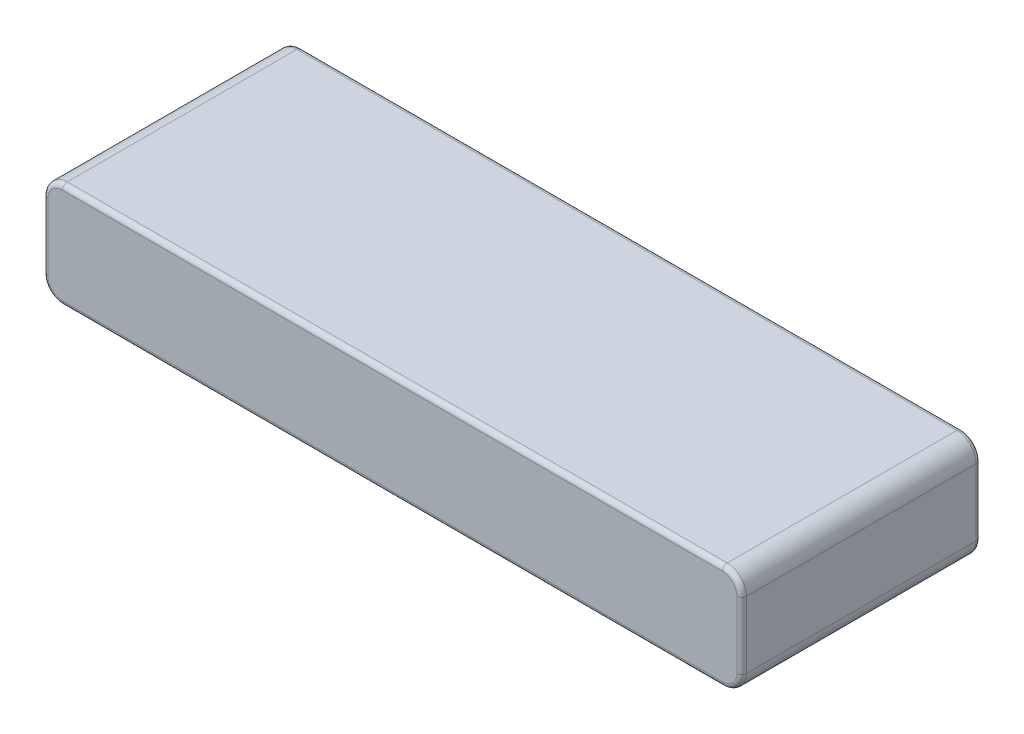
ISO-10303-21;
HEADER;
FILE_DESCRIPTION(('STEP AP214'),'2;1');
FILE_NAME('part.step','',(''),(''),'','','');
FILE_SCHEMA(('AUTOMOTIVE_DESIGN { 1 0 10303 214 1 1 1 1 }'));
ENDSEC;
DATA;
#1=APPLICATION_CONTEXT('core data for automotive mechanical design processes');
#2=APPLICATION_PROTOCOL_DEFINITION('international standard','automotive_design',2000,#1);
#3=PRODUCT_CONTEXT('',#1,'mechanical');
#4=PRODUCT('Part','Part','',(#3));
#5=PRODUCT_RELATED_PRODUCT_CATEGORY('part','',(#4));
#6=PRODUCT_DEFINITION_FORMATION('','',#4);
#7=PRODUCT_DEFINITION_CONTEXT('part definition',#1,'design');
#8=PRODUCT_DEFINITION('design','',#6,#7);
#9=PRODUCT_DEFINITION_SHAPE('','',#8);
#10=(LENGTH_UNIT() NAMED_UNIT(*) SI_UNIT(.MILLI.,.METRE.));
#11=(NAMED_UNIT(*) PLANE_ANGLE_UNIT() SI_UNIT($,.RADIAN.));
#12=(NAMED_UNIT(*) SI_UNIT($,.STERADIAN.) SOLID_ANGLE_UNIT());
#13=UNCERTAINTY_MEASURE_WITH_UNIT(LENGTH_MEASURE(1.E-05),#10,'distance_accuracy_value','');
#14=(GEOMETRIC_REPRESENTATION_CONTEXT(3) GLOBAL_UNCERTAINTY_ASSIGNED_CONTEXT((#13)) GLOBAL_UNIT_ASSIGNED_CONTEXT((#10,
#11,#12)) REPRESENTATION_CONTEXT('',''));
#15=CARTESIAN_POINT('',(0.,0.,0.));
#16=DIRECTION('',(0.,0.,1.));
#17=DIRECTION('',(1.,0.,0.));
#18=AXIS2_PLACEMENT_3D('',#15,#16,#17);
#19=CARTESIAN_POINT('',(72.4789,21.8694,-24.8158));
#20=DIRECTION('',(-1.,0.,0.));
#21=DIRECTION('',(0.,0.,1.));
#22=AXIS2_PLACEMENT_3D('',#19,#20,#21);
#23=PLANE('',#22);
#24=DIRECTION('',(0.,0.,-1.));
#25=VECTOR('',#24,1.);
#26=CARTESIAN_POINT('',(72.4789,17.8694,24.8158));
#27=LINE('',#26,#25);
#28=CARTESIAN_POINT('',(72.4789,17.8694,-23.8158));
#29=VERTEX_POINT('',#28);
#30=CARTESIAN_POINT('',(72.4789,17.8694,23.8158));
#31=VERTEX_POINT('',#30);
#32=EDGE_CURVE('E251',#29,#31,#27,.F.);
#33=ORIENTED_EDGE('',*,*,#32,.T.);
#34=DIRECTION('',(0.,-1.,0.));
#35=VECTOR('',#34,1.);
#36=CARTESIAN_POINT('',(72.4789,21.8694,23.8158));
#37=LINE('',#36,#35);
#38=CARTESIAN_POINT('',(72.4789,4.,23.8158));
#39=VERTEX_POINT('',#38);
#40=EDGE_CURVE('E214',#31,#39,#37,.T.);
#41=ORIENTED_EDGE('',*,*,#40,.T.);
#42=DIRECTION('',(0.,0.,-1.));
#43=VECTOR('',#42,1.);
#44=CARTESIAN_POINT('',(72.4789,4.,-24.8158));
#45=LINE('',#44,#43);
#46=CARTESIAN_POINT('',(72.4789,4.,-23.8158));
#47=VERTEX_POINT('',#46);
#48=EDGE_CURVE('E295',#39,#47,#45,.T.);
#49=ORIENTED_EDGE('',*,*,#48,.T.);
#50=DIRECTION('',(0.,-1.,0.));
#51=VECTOR('',#50,1.);
#52=CARTESIAN_POINT('',(72.4789,21.8694,-23.8158));
#53=LINE('',#52,#51);
#54=EDGE_CURVE('E212',#47,#29,#53,.F.);
#55=ORIENTED_EDGE('',*,*,#54,.T.);
#56=EDGE_LOOP('',(#33,#41,#49,#55));
#57=FACE_BOUND('',#56,.T.);
#58=ADVANCED_FACE('F32',(#57),#23,.F.);
#59=CARTESIAN_POINT('',(-72.4789,21.8694,-24.8158));
#60=DIRECTION('',(0.,0.,1.));
#61=DIRECTION('',(1.,0.,0.));
#62=AXIS2_PLACEMENT_3D('',#59,#60,#61);
#63=PLANE('',#62);
#64=DIRECTION('',(-1.,0.,0.));
#65=VECTOR('',#64,1.);
#66=CARTESIAN_POINT('',(68.4789,20.8694,-24.8158));
#67=LINE('',#66,#65);
#68=CARTESIAN_POINT('',(-68.4789,20.8694,-24.8158));
#69=VERTEX_POINT('',#68);
#70=CARTESIAN_POINT('',(68.4789,20.8694,-24.8158));
#71=VERTEX_POINT('',#70);
#72=EDGE_CURVE('E220',#69,#71,#67,.F.);
#73=ORIENTED_EDGE('',*,*,#72,.T.);
#74=CARTESIAN_POINT('',(68.4789,17.8694,-24.8158));
#75=DIRECTION('',(0.,0.,1.));
#76=DIRECTION('',(1.,0.,0.));
#77=AXIS2_PLACEMENT_3D('',#74,#75,#76);
#78=CIRCLE('',#77,3.);
#79=CARTESIAN_POINT('',(71.4789,17.8694,-24.8158));
#80=VERTEX_POINT('',#79);
#81=EDGE_CURVE('E233',#71,#80,#78,.F.);
#82=ORIENTED_EDGE('',*,*,#81,.T.);
#83=DIRECTION('',(0.,-1.,0.));
#84=VECTOR('',#83,1.);
#85=CARTESIAN_POINT('',(71.4789,21.8694,-24.8158));
#86=LINE('',#85,#84);
#87=CARTESIAN_POINT('',(71.4789,4.,-24.8158));
#88=VERTEX_POINT('',#87);
#89=EDGE_CURVE('E56',#80,#88,#86,.T.);
#90=ORIENTED_EDGE('',*,*,#89,.T.);
#91=CARTESIAN_POINT('',(68.4789,4.,-24.8158));
#92=DIRECTION('',(0.,0.,1.));
#93=DIRECTION('',(1.,0.,0.));
#94=AXIS2_PLACEMENT_3D('',#91,#92,#93);
#95=CIRCLE('',#94,3.);
#96=CARTESIAN_POINT('',(68.4789,1.,-24.8158));
#97=VERTEX_POINT('',#96);
#98=EDGE_CURVE('E230',#88,#97,#95,.F.);
#99=ORIENTED_EDGE('',*,*,#98,.T.);
#100=DIRECTION('',(-1.,0.,0.));
#101=VECTOR('',#100,1.);
#102=CARTESIAN_POINT('',(-72.4789,1.,-24.8158));
#103=LINE('',#102,#101);
#104=CARTESIAN_POINT('',(-68.4789,1.,-24.8158));
#105=VERTEX_POINT('',#104);
#106=EDGE_CURVE('E228',#97,#105,#103,.T.);
#107=ORIENTED_EDGE('',*,*,#106,.T.);
#108=CARTESIAN_POINT('',(-68.4789,4.,-24.8158));
#109=DIRECTION('',(0.,0.,1.));
#110=DIRECTION('',(1.,0.,0.));
#111=AXIS2_PLACEMENT_3D('',#108,#109,#110);
#112=CIRCLE('',#111,3.);
#113=CARTESIAN_POINT('',(-71.4789,4.,-24.8158));
#114=VERTEX_POINT('',#113);
#115=EDGE_CURVE('E226',#105,#114,#112,.F.);
#116=ORIENTED_EDGE('',*,*,#115,.T.);
#117=DIRECTION('',(0.,-1.,0.));
#118=VECTOR('',#117,1.);
#119=CARTESIAN_POINT('',(-71.4789,21.8694,-24.8158));
#120=LINE('',#119,#118);
#121=CARTESIAN_POINT('',(-71.4789,17.8694,-24.8158));
#122=VERTEX_POINT('',#121);
#123=EDGE_CURVE('E224',#114,#122,#120,.F.);
#124=ORIENTED_EDGE('',*,*,#123,.T.);
#125=CARTESIAN_POINT('',(-68.4789,17.8694,-24.8158));
#126=DIRECTION('',(0.,0.,1.));
#127=DIRECTION('',(1.,0.,0.));
#128=AXIS2_PLACEMENT_3D('',#125,#126,#127);
#129=CIRCLE('',#128,3.);
#130=EDGE_CURVE('E222',#122,#69,#129,.F.);
#131=ORIENTED_EDGE('',*,*,#130,.T.);
#132=EDGE_LOOP('',(#73,#82,#90,#99,#107,#116,#124,#131));
#133=FACE_BOUND('',#132,.T.);
#134=ADVANCED_FACE('F369',(#133),#63,.F.);
#135=CARTESIAN_POINT('',(-72.4789,21.8694,-24.8158));
#136=DIRECTION('',(1.,0.,0.));
#137=DIRECTION('',(0.,0.,-1.));
#138=AXIS2_PLACEMENT_3D('',#135,#136,#137);
#139=PLANE('',#138);
#140=DIRECTION('',(0.,0.,1.));
#141=VECTOR('',#140,1.);
#142=CARTESIAN_POINT('',(-72.4789,4.,-24.8158));
#143=LINE('',#142,#141);
#144=CARTESIAN_POINT('',(-72.4789,4.,-23.8158));
#145=VERTEX_POINT('',#144);
#146=CARTESIAN_POINT('',(-72.4789,4.,23.8158));
#147=VERTEX_POINT('',#146);
#148=EDGE_CURVE('E173',#145,#147,#143,.T.);
#149=ORIENTED_EDGE('',*,*,#148,.T.);
#150=DIRECTION('',(0.,-1.,0.));
#151=VECTOR('',#150,1.);
#152=CARTESIAN_POINT('',(-72.4789,21.8694,23.8158));
#153=LINE('',#152,#151);
#154=CARTESIAN_POINT('',(-72.4789,17.8694,23.8158));
#155=VERTEX_POINT('',#154);
#156=EDGE_CURVE('E198',#147,#155,#153,.F.);
#157=ORIENTED_EDGE('',*,*,#156,.T.);
#158=DIRECTION('',(0.,0.,1.));
#159=VECTOR('',#158,1.);
#160=CARTESIAN_POINT('',(-72.4789,17.8694,-24.8158));
#161=LINE('',#160,#159);
#162=CARTESIAN_POINT('',(-72.4789,17.8694,-23.8158));
#163=VERTEX_POINT('',#162);
#164=EDGE_CURVE('E176',#155,#163,#161,.F.);
#165=ORIENTED_EDGE('',*,*,#164,.T.);
#166=DIRECTION('',(0.,-1.,0.));
#167=VECTOR('',#166,1.);
#168=CARTESIAN_POINT('',(-72.4789,21.8694,-23.8158));
#169=LINE('',#168,#167);
#170=EDGE_CURVE('E196',#163,#145,#169,.T.);
#171=ORIENTED_EDGE('',*,*,#170,.T.);
#172=EDGE_LOOP('',(#149,#157,#165,#171));
#173=FACE_BOUND('',#172,.T.);
#174=ADVANCED_FACE('F310',(#173),#139,.F.);
#175=CARTESIAN_POINT('',(-72.4789,21.8694,24.8158));
#176=DIRECTION('',(0.,0.,-1.));
#177=DIRECTION('',(-1.,0.,0.));
#178=AXIS2_PLACEMENT_3D('',#175,#176,#177);
#179=PLANE('',#178);
#180=DIRECTION('',(1.,0.,0.));
#181=VECTOR('',#180,1.);
#182=CARTESIAN_POINT('',(-68.4789,20.8694,24.8158));
#183=LINE('',#182,#181);
#184=CARTESIAN_POINT('',(68.4789,20.8694,24.8158));
#185=VERTEX_POINT('',#184);
#186=CARTESIAN_POINT('',(-68.4789,20.8694,24.8158));
#187=VERTEX_POINT('',#186);
#188=EDGE_CURVE('E152',#185,#187,#183,.F.);
#189=ORIENTED_EDGE('',*,*,#188,.T.);
#190=CARTESIAN_POINT('',(-68.4789,17.8694,24.8158));
#191=DIRECTION('',(0.,0.,-1.));
#192=DIRECTION('',(-1.,0.,0.));
#193=AXIS2_PLACEMENT_3D('',#190,#191,#192);
#194=CIRCLE('',#193,3.);
#195=CARTESIAN_POINT('',(-71.4789,17.8694,24.8158));
#196=VERTEX_POINT('',#195);
#197=EDGE_CURVE('E189',#187,#196,#194,.F.);
#198=ORIENTED_EDGE('',*,*,#197,.T.);
#199=DIRECTION('',(0.,-1.,0.));
#200=VECTOR('',#199,1.);
#201=CARTESIAN_POINT('',(-71.4789,21.8694,24.8158));
#202=LINE('',#201,#200);
#203=CARTESIAN_POINT('',(-71.4789,4.,24.8158));
#204=VERTEX_POINT('',#203);
#205=EDGE_CURVE('E187',#196,#204,#202,.T.);
#206=ORIENTED_EDGE('',*,*,#205,.T.);
#207=CARTESIAN_POINT('',(-68.4789,4.,24.8158));
#208=DIRECTION('',(0.,0.,-1.));
#209=DIRECTION('',(-1.,0.,0.));
#210=AXIS2_PLACEMENT_3D('',#207,#208,#209);
#211=CIRCLE('',#210,3.);
#212=CARTESIAN_POINT('',(-68.4789,1.,24.8158));
#213=VERTEX_POINT('',#212);
#214=EDGE_CURVE('E185',#204,#213,#211,.F.);
#215=ORIENTED_EDGE('',*,*,#214,.T.);
#216=DIRECTION('',(1.,0.,0.));
#217=VECTOR('',#216,1.);
#218=CARTESIAN_POINT('',(-72.4789,1.,24.8158));
#219=LINE('',#218,#217);
#220=CARTESIAN_POINT('',(68.4789,1.,24.8158));
#221=VERTEX_POINT('',#220);
#222=EDGE_CURVE('E183',#213,#221,#219,.T.);
#223=ORIENTED_EDGE('',*,*,#222,.T.);
#224=CARTESIAN_POINT('',(68.4789,4.,24.8158));
#225=DIRECTION('',(0.,0.,-1.));
#226=DIRECTION('',(-1.,0.,0.));
#227=AXIS2_PLACEMENT_3D('',#224,#225,#226);
#228=CIRCLE('',#227,3.);
#229=CARTESIAN_POINT('',(71.4789,4.,24.8158));
#230=VERTEX_POINT('',#229);
#231=EDGE_CURVE('E181',#221,#230,#228,.F.);
#232=ORIENTED_EDGE('',*,*,#231,.T.);
#233=DIRECTION('',(0.,-1.,0.));
#234=VECTOR('',#233,1.);
#235=CARTESIAN_POINT('',(71.4789,21.8694,24.8158));
#236=LINE('',#235,#234);
#237=CARTESIAN_POINT('',(71.4789,17.8694,24.8158));
#238=VERTEX_POINT('',#237);
#239=EDGE_CURVE('E155',#230,#238,#236,.F.);
#240=ORIENTED_EDGE('',*,*,#239,.T.);
#241=CARTESIAN_POINT('',(68.4789,17.8694,24.8158));
#242=DIRECTION('',(0.,0.,-1.));
#243=DIRECTION('',(-1.,0.,0.));
#244=AXIS2_PLACEMENT_3D('',#241,#242,#243);
#245=CIRCLE('',#244,3.);
#246=EDGE_CURVE('E147',#238,#185,#245,.F.);
#247=ORIENTED_EDGE('',*,*,#246,.T.);
#248=EDGE_LOOP('',(#189,#198,#206,#215,#223,#232,#240,#247));
#249=FACE_BOUND('',#248,.T.);
#250=ADVANCED_FACE('F149',(#249),#179,.F.);
#251=CARTESIAN_POINT('',(0.,21.8694,0.));
#252=DIRECTION('',(0.,1.,0.));
#253=DIRECTION('',(0.,0.,1.));
#254=AXIS2_PLACEMENT_3D('',#251,#252,#253);
#255=PLANE('',#254);
#256=DIRECTION('',(0.,0.,1.));
#257=VECTOR('',#256,1.);
#258=CARTESIAN_POINT('',(-68.4789,21.8694,24.8158));
#259=LINE('',#258,#257);
#260=CARTESIAN_POINT('',(-68.4789,21.8694,-23.8158));
#261=VERTEX_POINT('',#260);
#262=CARTESIAN_POINT('',(-68.4789,21.8694,23.8158));
#263=VERTEX_POINT('',#262);
#264=EDGE_CURVE('E297',#261,#263,#259,.T.);
#265=ORIENTED_EDGE('',*,*,#264,.T.);
#266=DIRECTION('',(1.,0.,0.));
#267=VECTOR('',#266,1.);
#268=CARTESIAN_POINT('',(68.4789,21.8694,23.8158));
#269=LINE('',#268,#267);
#270=CARTESIAN_POINT('',(68.4789,21.8694,23.8158));
#271=VERTEX_POINT('',#270);
#272=EDGE_CURVE('E11',#263,#271,#269,.T.);
#273=ORIENTED_EDGE('',*,*,#272,.T.);
#274=DIRECTION('',(0.,0.,-1.));
#275=VECTOR('',#274,1.);
#276=CARTESIAN_POINT('',(68.4789,21.8694,-24.8158));
#277=LINE('',#276,#275);
#278=CARTESIAN_POINT('',(68.4789,21.8694,-23.8158));
#279=VERTEX_POINT('',#278);
#280=EDGE_CURVE('E305',#271,#279,#277,.T.);
#281=ORIENTED_EDGE('',*,*,#280,.T.);
#282=DIRECTION('',(-1.,0.,0.));
#283=VECTOR('',#282,1.);
#284=CARTESIAN_POINT('',(-68.4789,21.8694,-23.8158));
#285=LINE('',#284,#283);
#286=EDGE_CURVE('E41',#279,#261,#285,.T.);
#287=ORIENTED_EDGE('',*,*,#286,.T.);
#288=EDGE_LOOP('',(#265,#273,#281,#287));
#289=FACE_BOUND('',#288,.T.);
#290=ADVANCED_FACE('F365',(#289),#255,.T.);
#291=CARTESIAN_POINT('',(0.,0.,0.));
#292=DIRECTION('',(0.,1.,0.));
#293=DIRECTION('',(0.,0.,1.));
#294=AXIS2_PLACEMENT_3D('',#291,#292,#293);
#295=PLANE('',#294);
#296=DIRECTION('',(0.,0.,-1.));
#297=VECTOR('',#296,1.);
#298=CARTESIAN_POINT('',(68.4789,0.,0.));
#299=LINE('',#298,#297);
#300=CARTESIAN_POINT('',(68.4789,0.,-23.8158));
#301=VERTEX_POINT('',#300);
#302=CARTESIAN_POINT('',(68.4789,0.,23.8158));
#303=VERTEX_POINT('',#302);
#304=EDGE_CURVE('E294',#301,#303,#299,.F.);
#305=ORIENTED_EDGE('',*,*,#304,.T.);
#306=DIRECTION('',(1.,0.,0.));
#307=VECTOR('',#306,1.);
#308=CARTESIAN_POINT('',(0.,0.,23.8158));
#309=LINE('',#308,#307);
#310=CARTESIAN_POINT('',(-68.4789,0.,23.8158));
#311=VERTEX_POINT('',#310);
#312=EDGE_CURVE('E206',#303,#311,#309,.F.);
#313=ORIENTED_EDGE('',*,*,#312,.T.);
#314=DIRECTION('',(0.,0.,1.));
#315=VECTOR('',#314,1.);
#316=CARTESIAN_POINT('',(-68.4789,0.,0.));
#317=LINE('',#316,#315);
#318=CARTESIAN_POINT('',(-68.4789,0.,-23.8158));
#319=VERTEX_POINT('',#318);
#320=EDGE_CURVE('E287',#311,#319,#317,.F.);
#321=ORIENTED_EDGE('',*,*,#320,.T.);
#322=DIRECTION('',(-1.,0.,0.));
#323=VECTOR('',#322,1.);
#324=CARTESIAN_POINT('',(0.,0.,-23.8158));
#325=LINE('',#324,#323);
#326=EDGE_CURVE('E204',#319,#301,#325,.F.);
#327=ORIENTED_EDGE('',*,*,#326,.T.);
#328=EDGE_LOOP('',(#305,#313,#321,#327));
#329=FACE_BOUND('',#328,.T.);
#330=ADVANCED_FACE('F291',(#329),#295,.F.);
#331=CARTESIAN_POINT('',(68.4789,4.,-24.8158));
#332=DIRECTION('',(0.,0.,-1.));
#333=DIRECTION('',(-1.,0.,0.));
#334=AXIS2_PLACEMENT_3D('',#331,#332,#333);
#335=CYLINDRICAL_SURFACE('',#334,4.);
#336=ORIENTED_EDGE('',*,*,#48,.F.);
#337=CARTESIAN_POINT('',(68.4789,4.,23.8158));
#338=DIRECTION('',(0.,0.,-1.));
#339=DIRECTION('',(-1.,0.,0.));
#340=AXIS2_PLACEMENT_3D('',#337,#338,#339);
#341=CIRCLE('',#340,4.);
#342=EDGE_CURVE('E210',#39,#303,#341,.T.);
#343=ORIENTED_EDGE('',*,*,#342,.T.);
#344=ORIENTED_EDGE('',*,*,#304,.F.);
#345=CARTESIAN_POINT('',(68.4789,4.,-23.8158));
#346=DIRECTION('',(0.,0.,1.));
#347=DIRECTION('',(1.,0.,0.));
#348=AXIS2_PLACEMENT_3D('',#345,#346,#347);
#349=CIRCLE('',#348,4.);
#350=EDGE_CURVE('E208',#301,#47,#349,.T.);
#351=ORIENTED_EDGE('',*,*,#350,.T.);
#352=EDGE_LOOP('',(#336,#343,#344,#351));
#353=FACE_BOUND('',#352,.T.);
#354=ADVANCED_FACE('F346',(#353),#335,.T.);
#355=CARTESIAN_POINT('',(68.4789,17.8694,0.));
#356=DIRECTION('',(0.,0.,1.));
#357=DIRECTION('',(1.,0.,0.));
#358=AXIS2_PLACEMENT_3D('',#355,#356,#357);
#359=CYLINDRICAL_SURFACE('',#358,4.);
#360=ORIENTED_EDGE('',*,*,#280,.F.);
#361=CARTESIAN_POINT('',(68.4789,17.8694,23.8158));
#362=DIRECTION('',(0.,0.,-1.));
#363=DIRECTION('',(-1.,0.,0.));
#364=AXIS2_PLACEMENT_3D('',#361,#362,#363);
#365=CIRCLE('',#364,4.);
#366=EDGE_CURVE('E164',#271,#31,#365,.T.);
#367=ORIENTED_EDGE('',*,*,#366,.T.);
#368=ORIENTED_EDGE('',*,*,#32,.F.);
#369=CARTESIAN_POINT('',(68.4789,17.8694,-23.8158));
#370=DIRECTION('',(0.,0.,1.));
#371=DIRECTION('',(1.,0.,0.));
#372=AXIS2_PLACEMENT_3D('',#369,#370,#371);
#373=CIRCLE('',#372,4.);
#374=EDGE_CURVE('E216',#29,#279,#373,.T.);
#375=ORIENTED_EDGE('',*,*,#374,.T.);
#376=EDGE_LOOP('',(#360,#367,#368,#375));
#377=FACE_BOUND('',#376,.T.);
#378=ADVANCED_FACE('F356',(#377),#359,.T.);
#379=CARTESIAN_POINT('',(-68.4789,4.,-24.8158));
#380=DIRECTION('',(0.,0.,1.));
#381=DIRECTION('',(1.,0.,0.));
#382=AXIS2_PLACEMENT_3D('',#379,#380,#381);
#383=CYLINDRICAL_SURFACE('',#382,4.);
#384=ORIENTED_EDGE('',*,*,#320,.F.);
#385=CARTESIAN_POINT('',(-68.4789,4.,23.8158));
#386=DIRECTION('',(0.,0.,-1.));
#387=DIRECTION('',(-1.,0.,0.));
#388=AXIS2_PLACEMENT_3D('',#385,#386,#387);
#389=CIRCLE('',#388,4.);
#390=EDGE_CURVE('E202',#311,#147,#389,.T.);
#391=ORIENTED_EDGE('',*,*,#390,.T.);
#392=ORIENTED_EDGE('',*,*,#148,.F.);
#393=CARTESIAN_POINT('',(-68.4789,4.,-23.8158));
#394=DIRECTION('',(0.,0.,1.));
#395=DIRECTION('',(1.,0.,0.));
#396=AXIS2_PLACEMENT_3D('',#393,#394,#395);
#397=CIRCLE('',#396,4.);
#398=EDGE_CURVE('E200',#145,#319,#397,.T.);
#399=ORIENTED_EDGE('',*,*,#398,.T.);
#400=EDGE_LOOP('',(#384,#391,#392,#399));
#401=FACE_BOUND('',#400,.T.);
#402=ADVANCED_FACE('F286',(#401),#383,.T.);
#403=CARTESIAN_POINT('',(-68.4789,17.8694,0.));
#404=DIRECTION('',(0.,0.,-1.));
#405=DIRECTION('',(-1.,0.,0.));
#406=AXIS2_PLACEMENT_3D('',#403,#404,#405);
#407=CYLINDRICAL_SURFACE('',#406,4.);
#408=ORIENTED_EDGE('',*,*,#164,.F.);
#409=CARTESIAN_POINT('',(-68.4789,17.8694,23.8158));
#410=DIRECTION('',(0.,0.,-1.));
#411=DIRECTION('',(-1.,0.,0.));
#412=AXIS2_PLACEMENT_3D('',#409,#410,#411);
#413=CIRCLE('',#412,4.);
#414=EDGE_CURVE('E193',#155,#263,#413,.T.);
#415=ORIENTED_EDGE('',*,*,#414,.T.);
#416=ORIENTED_EDGE('',*,*,#264,.F.);
#417=CARTESIAN_POINT('',(-68.4789,17.8694,-23.8158));
#418=DIRECTION('',(0.,0.,1.));
#419=DIRECTION('',(1.,0.,0.));
#420=AXIS2_PLACEMENT_3D('',#417,#418,#419);
#421=CIRCLE('',#420,4.);
#422=EDGE_CURVE('E191',#261,#163,#421,.T.);
#423=ORIENTED_EDGE('',*,*,#422,.T.);
#424=EDGE_LOOP('',(#408,#415,#416,#423));
#425=FACE_BOUND('',#424,.T.);
#426=ADVANCED_FACE('F314',(#425),#407,.T.);
#427=CARTESIAN_POINT('',(68.4789,4.,23.8158));
#428=DIRECTION('',(0.,0.,-1.));
#429=DIRECTION('',(-1.,0.,0.));
#430=AXIS2_PLACEMENT_3D('',#427,#428,#429);
#431=TOROIDAL_SURFACE('',#430,3.,1.);
#432=CARTESIAN_POINT('',(68.4789,1.,23.8158));
#433=DIRECTION('',(-1.,0.,0.));
#434=DIRECTION('',(0.,0.,1.));
#435=AXIS2_PLACEMENT_3D('',#432,#433,#434);
#436=CIRCLE('',#435,1.);
#437=EDGE_CURVE('E245',#303,#221,#436,.T.);
#438=ORIENTED_EDGE('',*,*,#437,.F.);
#439=ORIENTED_EDGE('',*,*,#342,.F.);
#440=CARTESIAN_POINT('',(71.4789,4.,23.8158));
#441=DIRECTION('',(0.,1.,0.));
#442=DIRECTION('',(0.,0.,1.));
#443=AXIS2_PLACEMENT_3D('',#440,#441,#442);
#444=CIRCLE('',#443,1.);
#445=EDGE_CURVE('E248',#230,#39,#444,.T.);
#446=ORIENTED_EDGE('',*,*,#445,.F.);
#447=ORIENTED_EDGE('',*,*,#231,.F.);
#448=EDGE_LOOP('',(#438,#439,#446,#447));
#449=FACE_BOUND('',#448,.T.);
#450=ADVANCED_FACE('F335',(#449),#431,.T.);
#451=CARTESIAN_POINT('',(71.4789,21.8694,23.8158));
#452=DIRECTION('',(0.,-1.,0.));
#453=DIRECTION('',(0.,0.,-1.));
#454=AXIS2_PLACEMENT_3D('',#451,#452,#453);
#455=CYLINDRICAL_SURFACE('',#454,1.);
#456=ORIENTED_EDGE('',*,*,#445,.T.);
#457=ORIENTED_EDGE('',*,*,#40,.F.);
#458=CARTESIAN_POINT('',(71.4789,17.8694,23.8158));
#459=DIRECTION('',(0.,1.,0.));
#460=DIRECTION('',(0.,0.,1.));
#461=AXIS2_PLACEMENT_3D('',#458,#459,#460);
#462=CIRCLE('',#461,1.);
#463=EDGE_CURVE('E243',#238,#31,#462,.T.);
#464=ORIENTED_EDGE('',*,*,#463,.F.);
#465=ORIENTED_EDGE('',*,*,#239,.F.);
#466=EDGE_LOOP('',(#456,#457,#464,#465));
#467=FACE_BOUND('',#466,.T.);
#468=ADVANCED_FACE('F339',(#467),#455,.T.);
#469=CARTESIAN_POINT('',(-72.4789,1.,23.8158));
#470=DIRECTION('',(1.,0.,0.));
#471=DIRECTION('',(0.,0.,-1.));
#472=AXIS2_PLACEMENT_3D('',#469,#470,#471);
#473=CYLINDRICAL_SURFACE('',#472,1.);
#474=ORIENTED_EDGE('',*,*,#437,.T.);
#475=ORIENTED_EDGE('',*,*,#222,.F.);
#476=CARTESIAN_POINT('',(-68.4789,1.,23.8158));
#477=DIRECTION('',(-1.,0.,0.));
#478=DIRECTION('',(0.,0.,1.));
#479=AXIS2_PLACEMENT_3D('',#476,#477,#478);
#480=CIRCLE('',#479,1.);
#481=EDGE_CURVE('E167',#311,#213,#480,.T.);
#482=ORIENTED_EDGE('',*,*,#481,.F.);
#483=ORIENTED_EDGE('',*,*,#312,.F.);
#484=EDGE_LOOP('',(#474,#475,#482,#483));
#485=FACE_BOUND('',#484,.T.);
#486=ADVANCED_FACE('F330',(#485),#473,.T.);
#487=CARTESIAN_POINT('',(68.4789,17.8694,23.8158));
#488=DIRECTION('',(0.,0.,-1.));
#489=DIRECTION('',(-1.,0.,0.));
#490=AXIS2_PLACEMENT_3D('',#487,#488,#489);
#491=TOROIDAL_SURFACE('',#490,3.,1.);
#492=ORIENTED_EDGE('',*,*,#463,.T.);
#493=ORIENTED_EDGE('',*,*,#366,.F.);
#494=CARTESIAN_POINT('',(68.4789,20.8694,23.8158));
#495=DIRECTION('',(-1.,0.,0.));
#496=DIRECTION('',(0.,0.,1.));
#497=AXIS2_PLACEMENT_3D('',#494,#495,#496);
#498=CIRCLE('',#497,1.);
#499=EDGE_CURVE('E162',#185,#271,#498,.T.);
#500=ORIENTED_EDGE('',*,*,#499,.F.);
#501=ORIENTED_EDGE('',*,*,#246,.F.);
#502=EDGE_LOOP('',(#492,#493,#500,#501));
#503=FACE_BOUND('',#502,.T.);
#504=ADVANCED_FACE('F163',(#503),#491,.T.);
#505=CARTESIAN_POINT('',(-68.4789,4.,23.8158));
#506=DIRECTION('',(0.,0.,-1.));
#507=DIRECTION('',(-1.,0.,0.));
#508=AXIS2_PLACEMENT_3D('',#505,#506,#507);
#509=TOROIDAL_SURFACE('',#508,3.,1.);
#510=ORIENTED_EDGE('',*,*,#481,.T.);
#511=ORIENTED_EDGE('',*,*,#214,.F.);
#512=CARTESIAN_POINT('',(-71.4789,4.,23.8158));
#513=DIRECTION('',(0.,1.,0.));
#514=DIRECTION('',(0.,0.,1.));
#515=AXIS2_PLACEMENT_3D('',#512,#513,#514);
#516=CIRCLE('',#515,1.);
#517=EDGE_CURVE('E168',#147,#204,#516,.T.);
#518=ORIENTED_EDGE('',*,*,#517,.F.);
#519=ORIENTED_EDGE('',*,*,#390,.F.);
#520=EDGE_LOOP('',(#510,#511,#518,#519));
#521=FACE_BOUND('',#520,.T.);
#522=ADVANCED_FACE('F327',(#521),#509,.T.);
#523=CARTESIAN_POINT('',(0.,20.8694,23.8158));
#524=DIRECTION('',(-1.,0.,0.));
#525=DIRECTION('',(0.,0.,1.));
#526=AXIS2_PLACEMENT_3D('',#523,#524,#525);
#527=CYLINDRICAL_SURFACE('',#526,1.);
#528=ORIENTED_EDGE('',*,*,#499,.T.);
#529=ORIENTED_EDGE('',*,*,#272,.F.);
#530=CARTESIAN_POINT('',(-68.4789,20.8694,23.8158));
#531=DIRECTION('',(-1.,0.,0.));
#532=DIRECTION('',(0.,0.,1.));
#533=AXIS2_PLACEMENT_3D('',#530,#531,#532);
#534=CIRCLE('',#533,1.);
#535=EDGE_CURVE('E171',#187,#263,#534,.T.);
#536=ORIENTED_EDGE('',*,*,#535,.F.);
#537=ORIENTED_EDGE('',*,*,#188,.F.);
#538=EDGE_LOOP('',(#528,#529,#536,#537));
#539=FACE_BOUND('',#538,.T.);
#540=ADVANCED_FACE('F170',(#539),#527,.T.);
#541=CARTESIAN_POINT('',(-71.4789,21.8694,23.8158));
#542=DIRECTION('',(0.,-1.,0.));
#543=DIRECTION('',(0.,0.,-1.));
#544=AXIS2_PLACEMENT_3D('',#541,#542,#543);
#545=CYLINDRICAL_SURFACE('',#544,1.);
#546=ORIENTED_EDGE('',*,*,#517,.T.);
#547=ORIENTED_EDGE('',*,*,#205,.F.);
#548=CARTESIAN_POINT('',(-71.4789,17.8694,23.8158));
#549=DIRECTION('',(0.,1.,0.));
#550=DIRECTION('',(0.,0.,1.));
#551=AXIS2_PLACEMENT_3D('',#548,#549,#550);
#552=CIRCLE('',#551,1.);
#553=EDGE_CURVE('E236',#155,#196,#552,.T.);
#554=ORIENTED_EDGE('',*,*,#553,.F.);
#555=ORIENTED_EDGE('',*,*,#156,.F.);
#556=EDGE_LOOP('',(#546,#547,#554,#555));
#557=FACE_BOUND('',#556,.T.);
#558=ADVANCED_FACE('F322',(#557),#545,.T.);
#559=CARTESIAN_POINT('',(-68.4789,17.8694,23.8158));
#560=DIRECTION('',(0.,0.,-1.));
#561=DIRECTION('',(-1.,0.,0.));
#562=AXIS2_PLACEMENT_3D('',#559,#560,#561);
#563=TOROIDAL_SURFACE('',#562,3.,1.);
#564=ORIENTED_EDGE('',*,*,#535,.T.);
#565=ORIENTED_EDGE('',*,*,#414,.F.);
#566=ORIENTED_EDGE('',*,*,#553,.T.);
#567=ORIENTED_EDGE('',*,*,#197,.F.);
#568=EDGE_LOOP('',(#564,#565,#566,#567));
#569=FACE_BOUND('',#568,.T.);
#570=ADVANCED_FACE('F319',(#569),#563,.T.);
#571=CARTESIAN_POINT('',(-68.4789,4.,-23.8158));
#572=DIRECTION('',(0.,0.,1.));
#573=DIRECTION('',(1.,0.,0.));
#574=AXIS2_PLACEMENT_3D('',#571,#572,#573);
#575=TOROIDAL_SURFACE('',#574,3.,1.);
#576=CARTESIAN_POINT('',(-68.4789,1.,-23.8158));
#577=DIRECTION('',(1.,0.,0.));
#578=DIRECTION('',(0.,0.,-1.));
#579=AXIS2_PLACEMENT_3D('',#576,#577,#578);
#580=CIRCLE('',#579,1.);
#581=EDGE_CURVE('E266',#319,#105,#580,.T.);
#582=ORIENTED_EDGE('',*,*,#581,.F.);
#583=ORIENTED_EDGE('',*,*,#398,.F.);
#584=CARTESIAN_POINT('',(-71.4789,4.,-23.8158));
#585=DIRECTION('',(0.,1.,0.));
#586=DIRECTION('',(0.,0.,1.));
#587=AXIS2_PLACEMENT_3D('',#584,#585,#586);
#588=CIRCLE('',#587,1.);
#589=EDGE_CURVE('E36',#114,#145,#588,.T.);
#590=ORIENTED_EDGE('',*,*,#589,.F.);
#591=ORIENTED_EDGE('',*,*,#115,.F.);
#592=EDGE_LOOP('',(#582,#583,#590,#591));
#593=FACE_BOUND('',#592,.T.);
#594=ADVANCED_FACE('F34',(#593),#575,.T.);
#595=CARTESIAN_POINT('',(-71.4789,21.8694,-23.8158));
#596=DIRECTION('',(0.,-1.,0.));
#597=DIRECTION('',(0.,0.,-1.));
#598=AXIS2_PLACEMENT_3D('',#595,#596,#597);
#599=CYLINDRICAL_SURFACE('',#598,1.);
#600=ORIENTED_EDGE('',*,*,#589,.T.);
#601=ORIENTED_EDGE('',*,*,#170,.F.);
#602=CARTESIAN_POINT('',(-71.4789,17.8694,-23.8158));
#603=DIRECTION('',(0.,1.,0.));
#604=DIRECTION('',(0.,0.,1.));
#605=AXIS2_PLACEMENT_3D('',#602,#603,#604);
#606=CIRCLE('',#605,1.);
#607=EDGE_CURVE('E264',#122,#163,#606,.T.);
#608=ORIENTED_EDGE('',*,*,#607,.F.);
#609=ORIENTED_EDGE('',*,*,#123,.F.);
#610=EDGE_LOOP('',(#600,#601,#608,#609));
#611=FACE_BOUND('',#610,.T.);
#612=ADVANCED_FACE('F277',(#611),#599,.T.);
#613=CARTESIAN_POINT('',(-72.4789,1.,-23.8158));
#614=DIRECTION('',(-1.,0.,0.));
#615=DIRECTION('',(0.,0.,1.));
#616=AXIS2_PLACEMENT_3D('',#613,#614,#615);
#617=CYLINDRICAL_SURFACE('',#616,1.);
#618=ORIENTED_EDGE('',*,*,#581,.T.);
#619=ORIENTED_EDGE('',*,*,#106,.F.);
#620=CARTESIAN_POINT('',(68.4789,1.,-23.8158));
#621=DIRECTION('',(1.,0.,0.));
#622=DIRECTION('',(0.,0.,-1.));
#623=AXIS2_PLACEMENT_3D('',#620,#621,#622);
#624=CIRCLE('',#623,1.);
#625=EDGE_CURVE('E261',#301,#97,#624,.T.);
#626=ORIENTED_EDGE('',*,*,#625,.F.);
#627=ORIENTED_EDGE('',*,*,#326,.F.);
#628=EDGE_LOOP('',(#618,#619,#626,#627));
#629=FACE_BOUND('',#628,.T.);
#630=ADVANCED_FACE('F370',(#629),#617,.T.);
#631=CARTESIAN_POINT('',(-68.4789,17.8694,-23.8158));
#632=DIRECTION('',(0.,0.,1.));
#633=DIRECTION('',(1.,0.,0.));
#634=AXIS2_PLACEMENT_3D('',#631,#632,#633);
#635=TOROIDAL_SURFACE('',#634,3.,1.);
#636=ORIENTED_EDGE('',*,*,#607,.T.);
#637=ORIENTED_EDGE('',*,*,#422,.F.);
#638=CARTESIAN_POINT('',(-68.4789,20.8694,-23.8158));
#639=DIRECTION('',(1.,0.,0.));
#640=DIRECTION('',(0.,0.,-1.));
#641=AXIS2_PLACEMENT_3D('',#638,#639,#640);
#642=CIRCLE('',#641,1.);
#643=EDGE_CURVE('E258',#69,#261,#642,.T.);
#644=ORIENTED_EDGE('',*,*,#643,.F.);
#645=ORIENTED_EDGE('',*,*,#130,.F.);
#646=EDGE_LOOP('',(#636,#637,#644,#645));
#647=FACE_BOUND('',#646,.T.);
#648=ADVANCED_FACE('F367',(#647),#635,.T.);
#649=CARTESIAN_POINT('',(68.4789,4.,-23.8158));
#650=DIRECTION('',(0.,0.,1.));
#651=DIRECTION('',(1.,0.,0.));
#652=AXIS2_PLACEMENT_3D('',#649,#650,#651);
#653=TOROIDAL_SURFACE('',#652,3.,1.);
#654=ORIENTED_EDGE('',*,*,#625,.T.);
#655=ORIENTED_EDGE('',*,*,#98,.F.);
#656=CARTESIAN_POINT('',(71.4789,4.,-23.8158));
#657=DIRECTION('',(0.,1.,0.));
#658=DIRECTION('',(0.,0.,1.));
#659=AXIS2_PLACEMENT_3D('',#656,#657,#658);
#660=CIRCLE('',#659,1.);
#661=EDGE_CURVE('E255',#47,#88,#660,.T.);
#662=ORIENTED_EDGE('',*,*,#661,.F.);
#663=ORIENTED_EDGE('',*,*,#350,.F.);
#664=EDGE_LOOP('',(#654,#655,#662,#663));
#665=FACE_BOUND('',#664,.T.);
#666=ADVANCED_FACE('F350',(#665),#653,.T.);
#667=CARTESIAN_POINT('',(0.,20.8694,-23.8158));
#668=DIRECTION('',(1.,0.,0.));
#669=DIRECTION('',(0.,0.,-1.));
#670=AXIS2_PLACEMENT_3D('',#667,#668,#669);
#671=CYLINDRICAL_SURFACE('',#670,1.);
#672=ORIENTED_EDGE('',*,*,#643,.T.);
#673=ORIENTED_EDGE('',*,*,#286,.F.);
#674=CARTESIAN_POINT('',(68.4789,20.8694,-23.8158));
#675=DIRECTION('',(1.,0.,0.));
#676=DIRECTION('',(0.,0.,-1.));
#677=AXIS2_PLACEMENT_3D('',#674,#675,#676);
#678=CIRCLE('',#677,1.);
#679=EDGE_CURVE('E253',#71,#279,#678,.T.);
#680=ORIENTED_EDGE('',*,*,#679,.F.);
#681=ORIENTED_EDGE('',*,*,#72,.F.);
#682=EDGE_LOOP('',(#672,#673,#680,#681));
#683=FACE_BOUND('',#682,.T.);
#684=ADVANCED_FACE('F362',(#683),#671,.T.);
#685=CARTESIAN_POINT('',(71.4789,21.8694,-23.8158));
#686=DIRECTION('',(0.,-1.,0.));
#687=DIRECTION('',(0.,0.,-1.));
#688=AXIS2_PLACEMENT_3D('',#685,#686,#687);
#689=CYLINDRICAL_SURFACE('',#688,1.);
#690=ORIENTED_EDGE('',*,*,#661,.T.);
#691=ORIENTED_EDGE('',*,*,#89,.F.);
#692=CARTESIAN_POINT('',(71.4789,17.8694,-23.8158));
#693=DIRECTION('',(0.,1.,0.));
#694=DIRECTION('',(0.,0.,1.));
#695=AXIS2_PLACEMENT_3D('',#692,#693,#694);
#696=CIRCLE('',#695,1.);
#697=EDGE_CURVE('E49',#29,#80,#696,.T.);
#698=ORIENTED_EDGE('',*,*,#697,.F.);
#699=ORIENTED_EDGE('',*,*,#54,.F.);
#700=EDGE_LOOP('',(#690,#691,#698,#699));
#701=FACE_BOUND('',#700,.T.);
#702=ADVANCED_FACE('F353',(#701),#689,.T.);
#703=CARTESIAN_POINT('',(68.4789,17.8694,-23.8158));
#704=DIRECTION('',(0.,0.,1.));
#705=DIRECTION('',(1.,0.,0.));
#706=AXIS2_PLACEMENT_3D('',#703,#704,#705);
#707=TOROIDAL_SURFACE('',#706,3.,1.);
#708=ORIENTED_EDGE('',*,*,#679,.T.);
#709=ORIENTED_EDGE('',*,*,#374,.F.);
#710=ORIENTED_EDGE('',*,*,#697,.T.);
#711=ORIENTED_EDGE('',*,*,#81,.F.);
#712=EDGE_LOOP('',(#708,#709,#710,#711));
#713=FACE_BOUND('',#712,.T.);
#714=ADVANCED_FACE('F357',(#713),#707,.T.);
#715=CLOSED_SHELL('',(#58,#134,#174,#250,#290,#330,#354,#378,#402,#426,#450,#468,#486,#504,#522,
#540,#558,#570,#594,#612,#630,#648,#666,#684,#702,#714));
#716=MANIFOLD_SOLID_BREP('B2',#715);
#717=ADVANCED_BREP_SHAPE_REPRESENTATION('',(#18,#716),#14);
#718=SHAPE_DEFINITION_REPRESENTATION(#9,#717);
ENDSEC;
END-ISO-10303-21;
